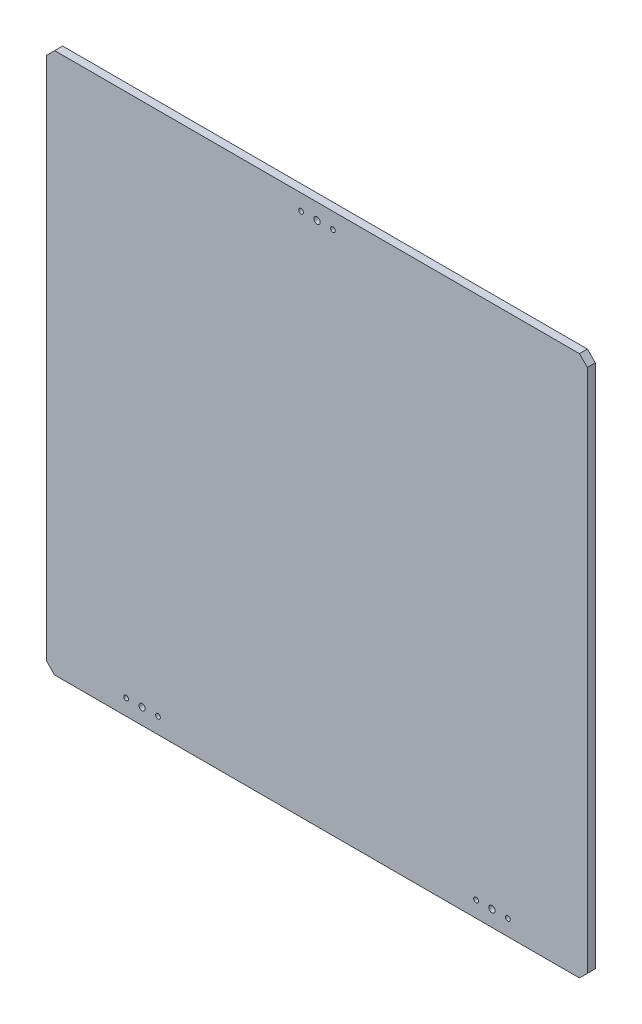
ISO-10303-21;
HEADER;
FILE_DESCRIPTION(('STEP AP214'),'2;1');
FILE_NAME('part.step','',(''),(''),'','','');
FILE_SCHEMA(('AUTOMOTIVE_DESIGN { 1 0 10303 214 1 1 1 1 }'));
ENDSEC;
DATA;
#1=APPLICATION_CONTEXT('core data for automotive mechanical design processes');
#2=APPLICATION_PROTOCOL_DEFINITION('international standard','automotive_design',2000,#1);
#3=PRODUCT_CONTEXT('',#1,'mechanical');
#4=PRODUCT('Part','Part','',(#3));
#5=PRODUCT_RELATED_PRODUCT_CATEGORY('part','',(#4));
#6=PRODUCT_DEFINITION_FORMATION('','',#4);
#7=PRODUCT_DEFINITION_CONTEXT('part definition',#1,'design');
#8=PRODUCT_DEFINITION('design','',#6,#7);
#9=PRODUCT_DEFINITION_SHAPE('','',#8);
#10=(LENGTH_UNIT() NAMED_UNIT(*) SI_UNIT(.MILLI.,.METRE.));
#11=(NAMED_UNIT(*) PLANE_ANGLE_UNIT() SI_UNIT($,.RADIAN.));
#12=(NAMED_UNIT(*) SI_UNIT($,.STERADIAN.) SOLID_ANGLE_UNIT());
#13=UNCERTAINTY_MEASURE_WITH_UNIT(LENGTH_MEASURE(1.E-05),#10,'distance_accuracy_value','');
#14=(GEOMETRIC_REPRESENTATION_CONTEXT(3) GLOBAL_UNCERTAINTY_ASSIGNED_CONTEXT((#13)) GLOBAL_UNIT_ASSIGNED_CONTEXT((#10,
#11,#12)) REPRESENTATION_CONTEXT('',''));
#15=CARTESIAN_POINT('',(0.,0.,0.));
#16=DIRECTION('',(0.,0.,1.));
#17=DIRECTION('',(1.,0.,0.));
#18=AXIS2_PLACEMENT_3D('',#15,#16,#17);
#19=CARTESIAN_POINT('',(170.,-170.,5.));
#20=DIRECTION('',(-1.,0.,0.));
#21=DIRECTION('',(0.,0.,1.));
#22=AXIS2_PLACEMENT_3D('',#19,#20,#21);
#23=PLANE('',#22);
#24=DIRECTION('',(0.,1.,0.));
#25=VECTOR('',#24,1.);
#26=CARTESIAN_POINT('',(170.,-170.,5.));
#27=LINE('',#26,#25);
#28=CARTESIAN_POINT('',(170.,-165.,5.));
#29=VERTEX_POINT('',#28);
#30=CARTESIAN_POINT('',(170.,165.,5.));
#31=VERTEX_POINT('',#30);
#32=EDGE_CURVE('E124',#29,#31,#27,.T.);
#33=ORIENTED_EDGE('',*,*,#32,.F.);
#34=DIRECTION('',(0.,0.,-1.));
#35=VECTOR('',#34,1.);
#36=CARTESIAN_POINT('',(170.,-165.,5.));
#37=LINE('',#36,#35);
#38=CARTESIAN_POINT('',(170.,-165.,0.));
#39=VERTEX_POINT('',#38);
#40=EDGE_CURVE('E150',#29,#39,#37,.T.);
#41=ORIENTED_EDGE('',*,*,#40,.T.);
#42=DIRECTION('',(0.,1.,0.));
#43=VECTOR('',#42,1.);
#44=CARTESIAN_POINT('',(170.,-170.,0.));
#45=LINE('',#44,#43);
#46=CARTESIAN_POINT('',(170.,165.,0.));
#47=VERTEX_POINT('',#46);
#48=EDGE_CURVE('E156',#39,#47,#45,.T.);
#49=ORIENTED_EDGE('',*,*,#48,.T.);
#50=DIRECTION('',(0.,0.,1.));
#51=VECTOR('',#50,1.);
#52=CARTESIAN_POINT('',(170.,165.,5.));
#53=LINE('',#52,#51);
#54=EDGE_CURVE('E148',#47,#31,#53,.T.);
#55=ORIENTED_EDGE('',*,*,#54,.T.);
#56=EDGE_LOOP('',(#33,#41,#49,#55));
#57=FACE_BOUND('',#56,.T.);
#58=ADVANCED_FACE('F32',(#57),#23,.F.);
#59=CARTESIAN_POINT('',(-170.,170.,5.));
#60=DIRECTION('',(0.,-1.,0.));
#61=DIRECTION('',(0.,0.,-1.));
#62=AXIS2_PLACEMENT_3D('',#59,#60,#61);
#63=PLANE('',#62);
#64=DIRECTION('',(-1.,0.,0.));
#65=VECTOR('',#64,1.);
#66=CARTESIAN_POINT('',(-170.,170.,5.));
#67=LINE('',#66,#65);
#68=CARTESIAN_POINT('',(165.,170.,5.));
#69=VERTEX_POINT('',#68);
#70=CARTESIAN_POINT('',(-165.,170.,5.));
#71=VERTEX_POINT('',#70);
#72=EDGE_CURVE('E127',#69,#71,#67,.T.);
#73=ORIENTED_EDGE('',*,*,#72,.F.);
#74=DIRECTION('',(0.,0.,-1.));
#75=VECTOR('',#74,1.);
#76=CARTESIAN_POINT('',(165.,170.,5.));
#77=LINE('',#76,#75);
#78=CARTESIAN_POINT('',(165.,170.,0.));
#79=VERTEX_POINT('',#78);
#80=EDGE_CURVE('E11',#69,#79,#77,.T.);
#81=ORIENTED_EDGE('',*,*,#80,.T.);
#82=DIRECTION('',(-1.,0.,0.));
#83=VECTOR('',#82,1.);
#84=CARTESIAN_POINT('',(-170.,170.,0.));
#85=LINE('',#84,#83);
#86=CARTESIAN_POINT('',(-165.,170.,0.));
#87=VERTEX_POINT('',#86);
#88=EDGE_CURVE('E129',#79,#87,#85,.T.);
#89=ORIENTED_EDGE('',*,*,#88,.T.);
#90=DIRECTION('',(0.,0.,1.));
#91=VECTOR('',#90,1.);
#92=CARTESIAN_POINT('',(-165.,170.,5.));
#93=LINE('',#92,#91);
#94=EDGE_CURVE('E40',#87,#71,#93,.T.);
#95=ORIENTED_EDGE('',*,*,#94,.T.);
#96=EDGE_LOOP('',(#73,#81,#89,#95));
#97=FACE_BOUND('',#96,.T.);
#98=ADVANCED_FACE('F262',(#97),#63,.F.);
#99=CARTESIAN_POINT('',(-170.,-170.,5.));
#100=DIRECTION('',(1.,0.,0.));
#101=DIRECTION('',(0.,0.,-1.));
#102=AXIS2_PLACEMENT_3D('',#99,#100,#101);
#103=PLANE('',#102);
#104=DIRECTION('',(0.,-1.,0.));
#105=VECTOR('',#104,1.);
#106=CARTESIAN_POINT('',(-170.,-170.,0.));
#107=LINE('',#106,#105);
#108=CARTESIAN_POINT('',(-170.,165.,0.));
#109=VERTEX_POINT('',#108);
#110=CARTESIAN_POINT('',(-170.,-165.,0.));
#111=VERTEX_POINT('',#110);
#112=EDGE_CURVE('E125',#109,#111,#107,.T.);
#113=ORIENTED_EDGE('',*,*,#112,.T.);
#114=DIRECTION('',(0.,0.,1.));
#115=VECTOR('',#114,1.);
#116=CARTESIAN_POINT('',(-170.,-165.,5.));
#117=LINE('',#116,#115);
#118=CARTESIAN_POINT('',(-170.,-165.,5.));
#119=VERTEX_POINT('',#118);
#120=EDGE_CURVE('E103',#111,#119,#117,.T.);
#121=ORIENTED_EDGE('',*,*,#120,.T.);
#122=DIRECTION('',(0.,-1.,0.));
#123=VECTOR('',#122,1.);
#124=CARTESIAN_POINT('',(-170.,-170.,5.));
#125=LINE('',#124,#123);
#126=CARTESIAN_POINT('',(-170.,165.,5.));
#127=VERTEX_POINT('',#126);
#128=EDGE_CURVE('E168',#127,#119,#125,.T.);
#129=ORIENTED_EDGE('',*,*,#128,.F.);
#130=DIRECTION('',(0.,0.,-1.));
#131=VECTOR('',#130,1.);
#132=CARTESIAN_POINT('',(-170.,165.,5.));
#133=LINE('',#132,#131);
#134=EDGE_CURVE('E108',#127,#109,#133,.T.);
#135=ORIENTED_EDGE('',*,*,#134,.T.);
#136=EDGE_LOOP('',(#113,#121,#129,#135));
#137=FACE_BOUND('',#136,.T.);
#138=ADVANCED_FACE('F260',(#137),#103,.F.);
#139=CARTESIAN_POINT('',(-170.,-170.,5.));
#140=DIRECTION('',(0.,1.,0.));
#141=DIRECTION('',(0.,0.,1.));
#142=AXIS2_PLACEMENT_3D('',#139,#140,#141);
#143=PLANE('',#142);
#144=DIRECTION('',(1.,0.,0.));
#145=VECTOR('',#144,1.);
#146=CARTESIAN_POINT('',(-170.,-170.,5.));
#147=LINE('',#146,#145);
#148=CARTESIAN_POINT('',(-165.,-170.,5.));
#149=VERTEX_POINT('',#148);
#150=CARTESIAN_POINT('',(165.,-170.,5.));
#151=VERTEX_POINT('',#150);
#152=EDGE_CURVE('E118',#149,#151,#147,.T.);
#153=ORIENTED_EDGE('',*,*,#152,.F.);
#154=DIRECTION('',(0.,0.,-1.));
#155=VECTOR('',#154,1.);
#156=CARTESIAN_POINT('',(-165.,-170.,5.));
#157=LINE('',#156,#155);
#158=CARTESIAN_POINT('',(-165.,-170.,0.));
#159=VERTEX_POINT('',#158);
#160=EDGE_CURVE('E102',#149,#159,#157,.T.);
#161=ORIENTED_EDGE('',*,*,#160,.T.);
#162=DIRECTION('',(1.,0.,0.));
#163=VECTOR('',#162,1.);
#164=CARTESIAN_POINT('',(-170.,-170.,0.));
#165=LINE('',#164,#163);
#166=CARTESIAN_POINT('',(165.,-170.,0.));
#167=VERTEX_POINT('',#166);
#168=EDGE_CURVE('E115',#159,#167,#165,.T.);
#169=ORIENTED_EDGE('',*,*,#168,.T.);
#170=DIRECTION('',(0.,0.,1.));
#171=VECTOR('',#170,1.);
#172=CARTESIAN_POINT('',(165.,-170.,5.));
#173=LINE('',#172,#171);
#174=EDGE_CURVE('E120',#167,#151,#173,.T.);
#175=ORIENTED_EDGE('',*,*,#174,.T.);
#176=EDGE_LOOP('',(#153,#161,#169,#175));
#177=FACE_BOUND('',#176,.T.);
#178=ADVANCED_FACE('F114',(#177),#143,.F.);
#179=CARTESIAN_POINT('',(0.,0.,5.));
#180=DIRECTION('',(0.,0.,-1.));
#181=DIRECTION('',(-1.,0.,0.));
#182=AXIS2_PLACEMENT_3D('',#179,#180,#181);
#183=PLANE('',#182);
#184=CARTESIAN_POINT('',(100.,-160.,5.));
#185=DIRECTION('',(0.,0.,-1.));
#186=DIRECTION('',(-1.,0.,0.));
#187=AXIS2_PLACEMENT_3D('',#184,#185,#186);
#188=CIRCLE('',#187,1.5);
#189=CARTESIAN_POINT('',(98.5,-160.,5.));
#190=VERTEX_POINT('',#189);
#191=EDGE_CURVE('E217',#190,#190,#188,.T.);
#192=ORIENTED_EDGE('',*,*,#191,.T.);
#193=EDGE_LOOP('',(#192));
#194=FACE_BOUND('',#193,.T.);
#195=CARTESIAN_POINT('',(110.,-160.,5.));
#196=DIRECTION('',(0.,0.,-1.));
#197=DIRECTION('',(-1.,0.,0.));
#198=AXIS2_PLACEMENT_3D('',#195,#196,#197);
#199=CIRCLE('',#198,2.);
#200=CARTESIAN_POINT('',(108.,-160.,5.));
#201=VERTEX_POINT('',#200);
#202=EDGE_CURVE('E211',#201,#201,#199,.T.);
#203=ORIENTED_EDGE('',*,*,#202,.T.);
#204=EDGE_LOOP('',(#203));
#205=FACE_BOUND('',#204,.T.);
#206=CARTESIAN_POINT('',(120.,-160.,5.));
#207=DIRECTION('',(0.,0.,-1.));
#208=DIRECTION('',(-1.,0.,0.));
#209=AXIS2_PLACEMENT_3D('',#206,#207,#208);
#210=CIRCLE('',#209,1.5);
#211=CARTESIAN_POINT('',(118.5,-160.,5.));
#212=VERTEX_POINT('',#211);
#213=EDGE_CURVE('E205',#212,#212,#210,.T.);
#214=ORIENTED_EDGE('',*,*,#213,.T.);
#215=EDGE_LOOP('',(#214));
#216=FACE_BOUND('',#215,.T.);
#217=CARTESIAN_POINT('',(10.,160.,5.));
#218=DIRECTION('',(0.,0.,1.));
#219=DIRECTION('',(1.,0.,0.));
#220=AXIS2_PLACEMENT_3D('',#217,#218,#219);
#221=CIRCLE('',#220,1.5);
#222=CARTESIAN_POINT('',(11.5,160.,5.));
#223=VERTEX_POINT('',#222);
#224=EDGE_CURVE('E199',#223,#223,#221,.T.);
#225=ORIENTED_EDGE('',*,*,#224,.F.);
#226=EDGE_LOOP('',(#225));
#227=FACE_BOUND('',#226,.T.);
#228=CARTESIAN_POINT('',(0.,160.,5.));
#229=DIRECTION('',(0.,0.,1.));
#230=DIRECTION('',(1.,0.,0.));
#231=AXIS2_PLACEMENT_3D('',#228,#229,#230);
#232=CIRCLE('',#231,2.);
#233=CARTESIAN_POINT('',(2.,160.,5.));
#234=VERTEX_POINT('',#233);
#235=EDGE_CURVE('E193',#234,#234,#232,.T.);
#236=ORIENTED_EDGE('',*,*,#235,.F.);
#237=EDGE_LOOP('',(#236));
#238=FACE_BOUND('',#237,.T.);
#239=CARTESIAN_POINT('',(-10.,160.,5.));
#240=DIRECTION('',(0.,0.,1.));
#241=DIRECTION('',(1.,0.,0.));
#242=AXIS2_PLACEMENT_3D('',#239,#240,#241);
#243=CIRCLE('',#242,1.5);
#244=CARTESIAN_POINT('',(-8.5,160.,5.));
#245=VERTEX_POINT('',#244);
#246=EDGE_CURVE('E187',#245,#245,#243,.T.);
#247=ORIENTED_EDGE('',*,*,#246,.F.);
#248=EDGE_LOOP('',(#247));
#249=FACE_BOUND('',#248,.T.);
#250=CARTESIAN_POINT('',(-100.,-160.,5.));
#251=DIRECTION('',(0.,0.,1.));
#252=DIRECTION('',(1.,0.,0.));
#253=AXIS2_PLACEMENT_3D('',#250,#251,#252);
#254=CIRCLE('',#253,1.5);
#255=CARTESIAN_POINT('',(-98.5,-160.,5.));
#256=VERTEX_POINT('',#255);
#257=EDGE_CURVE('E181',#256,#256,#254,.T.);
#258=ORIENTED_EDGE('',*,*,#257,.F.);
#259=EDGE_LOOP('',(#258));
#260=FACE_BOUND('',#259,.T.);
#261=CARTESIAN_POINT('',(-110.,-160.,5.));
#262=DIRECTION('',(0.,0.,1.));
#263=DIRECTION('',(1.,0.,0.));
#264=AXIS2_PLACEMENT_3D('',#261,#262,#263);
#265=CIRCLE('',#264,2.);
#266=CARTESIAN_POINT('',(-108.,-160.,5.));
#267=VERTEX_POINT('',#266);
#268=EDGE_CURVE('E175',#267,#267,#265,.T.);
#269=ORIENTED_EDGE('',*,*,#268,.F.);
#270=EDGE_LOOP('',(#269));
#271=FACE_BOUND('',#270,.T.);
#272=CARTESIAN_POINT('',(-120.,-160.,5.));
#273=DIRECTION('',(0.,0.,1.));
#274=DIRECTION('',(1.,0.,0.));
#275=AXIS2_PLACEMENT_3D('',#272,#273,#274);
#276=CIRCLE('',#275,1.5);
#277=CARTESIAN_POINT('',(-118.5,-160.,5.));
#278=VERTEX_POINT('',#277);
#279=EDGE_CURVE('E164',#278,#278,#276,.T.);
#280=ORIENTED_EDGE('',*,*,#279,.F.);
#281=EDGE_LOOP('',(#280));
#282=FACE_BOUND('',#281,.T.);
#283=ORIENTED_EDGE('',*,*,#128,.T.);
#284=DIRECTION('',(-0.707106781186544,0.707106781186551,0.));
#285=VECTOR('',#284,1.);
#286=CARTESIAN_POINT('',(-165.,-170.,5.));
#287=LINE('',#286,#285);
#288=EDGE_CURVE('E146',#119,#149,#287,.F.);
#289=ORIENTED_EDGE('',*,*,#288,.T.);
#290=ORIENTED_EDGE('',*,*,#152,.T.);
#291=DIRECTION('',(-0.707106781186551,-0.707106781186544,0.));
#292=VECTOR('',#291,1.);
#293=CARTESIAN_POINT('',(170.,-165.,5.));
#294=LINE('',#293,#292);
#295=EDGE_CURVE('E144',#151,#29,#294,.F.);
#296=ORIENTED_EDGE('',*,*,#295,.T.);
#297=ORIENTED_EDGE('',*,*,#32,.T.);
#298=DIRECTION('',(0.707106781186544,-0.707106781186551,0.));
#299=VECTOR('',#298,1.);
#300=CARTESIAN_POINT('',(165.,170.,5.));
#301=LINE('',#300,#299);
#302=EDGE_CURVE('E53',#31,#69,#301,.F.);
#303=ORIENTED_EDGE('',*,*,#302,.T.);
#304=ORIENTED_EDGE('',*,*,#72,.T.);
#305=DIRECTION('',(0.707106781186551,0.707106781186544,0.));
#306=VECTOR('',#305,1.);
#307=CARTESIAN_POINT('',(-170.,165.,5.));
#308=LINE('',#307,#306);
#309=EDGE_CURVE('E141',#71,#127,#308,.F.);
#310=ORIENTED_EDGE('',*,*,#309,.T.);
#311=EDGE_LOOP('',(#283,#289,#290,#296,#297,#303,#304,#310));
#312=FACE_BOUND('',#311,.T.);
#313=ADVANCED_FACE('F229',(#194,#205,#216,#227,#238,#249,#260,#271,#282,#312),#183,.F.);
#314=CARTESIAN_POINT('',(0.,0.,0.));
#315=DIRECTION('',(0.,0.,-1.));
#316=DIRECTION('',(-1.,0.,0.));
#317=AXIS2_PLACEMENT_3D('',#314,#315,#316);
#318=PLANE('',#317);
#319=CARTESIAN_POINT('',(100.,-160.,0.));
#320=DIRECTION('',(0.,0.,-1.));
#321=DIRECTION('',(-1.,0.,0.));
#322=AXIS2_PLACEMENT_3D('',#319,#320,#321);
#323=CIRCLE('',#322,1.5);
#324=CARTESIAN_POINT('',(98.5,-160.,0.));
#325=VERTEX_POINT('',#324);
#326=EDGE_CURVE('E214',#325,#325,#323,.T.);
#327=ORIENTED_EDGE('',*,*,#326,.F.);
#328=EDGE_LOOP('',(#327));
#329=FACE_BOUND('',#328,.T.);
#330=CARTESIAN_POINT('',(110.,-160.,0.));
#331=DIRECTION('',(0.,0.,-1.));
#332=DIRECTION('',(-1.,0.,0.));
#333=AXIS2_PLACEMENT_3D('',#330,#331,#332);
#334=CIRCLE('',#333,2.);
#335=CARTESIAN_POINT('',(108.,-160.,0.));
#336=VERTEX_POINT('',#335);
#337=EDGE_CURVE('E208',#336,#336,#334,.T.);
#338=ORIENTED_EDGE('',*,*,#337,.F.);
#339=EDGE_LOOP('',(#338));
#340=FACE_BOUND('',#339,.T.);
#341=CARTESIAN_POINT('',(120.,-160.,0.));
#342=DIRECTION('',(0.,0.,-1.));
#343=DIRECTION('',(-1.,0.,0.));
#344=AXIS2_PLACEMENT_3D('',#341,#342,#343);
#345=CIRCLE('',#344,1.5);
#346=CARTESIAN_POINT('',(118.5,-160.,0.));
#347=VERTEX_POINT('',#346);
#348=EDGE_CURVE('E202',#347,#347,#345,.T.);
#349=ORIENTED_EDGE('',*,*,#348,.F.);
#350=EDGE_LOOP('',(#349));
#351=FACE_BOUND('',#350,.T.);
#352=CARTESIAN_POINT('',(10.,160.,0.));
#353=DIRECTION('',(0.,0.,1.));
#354=DIRECTION('',(1.,0.,0.));
#355=AXIS2_PLACEMENT_3D('',#352,#353,#354);
#356=CIRCLE('',#355,1.5);
#357=CARTESIAN_POINT('',(11.5,160.,0.));
#358=VERTEX_POINT('',#357);
#359=EDGE_CURVE('E196',#358,#358,#356,.T.);
#360=ORIENTED_EDGE('',*,*,#359,.T.);
#361=EDGE_LOOP('',(#360));
#362=FACE_BOUND('',#361,.T.);
#363=CARTESIAN_POINT('',(0.,160.,0.));
#364=DIRECTION('',(0.,0.,1.));
#365=DIRECTION('',(1.,0.,0.));
#366=AXIS2_PLACEMENT_3D('',#363,#364,#365);
#367=CIRCLE('',#366,2.);
#368=CARTESIAN_POINT('',(2.,160.,0.));
#369=VERTEX_POINT('',#368);
#370=EDGE_CURVE('E190',#369,#369,#367,.T.);
#371=ORIENTED_EDGE('',*,*,#370,.T.);
#372=EDGE_LOOP('',(#371));
#373=FACE_BOUND('',#372,.T.);
#374=CARTESIAN_POINT('',(-10.,160.,0.));
#375=DIRECTION('',(0.,0.,1.));
#376=DIRECTION('',(1.,0.,0.));
#377=AXIS2_PLACEMENT_3D('',#374,#375,#376);
#378=CIRCLE('',#377,1.5);
#379=CARTESIAN_POINT('',(-8.5,160.,0.));
#380=VERTEX_POINT('',#379);
#381=EDGE_CURVE('E184',#380,#380,#378,.T.);
#382=ORIENTED_EDGE('',*,*,#381,.T.);
#383=EDGE_LOOP('',(#382));
#384=FACE_BOUND('',#383,.T.);
#385=CARTESIAN_POINT('',(-100.,-160.,0.));
#386=DIRECTION('',(0.,0.,1.));
#387=DIRECTION('',(1.,0.,0.));
#388=AXIS2_PLACEMENT_3D('',#385,#386,#387);
#389=CIRCLE('',#388,1.5);
#390=CARTESIAN_POINT('',(-98.5,-160.,0.));
#391=VERTEX_POINT('',#390);
#392=EDGE_CURVE('E178',#391,#391,#389,.T.);
#393=ORIENTED_EDGE('',*,*,#392,.T.);
#394=EDGE_LOOP('',(#393));
#395=FACE_BOUND('',#394,.T.);
#396=CARTESIAN_POINT('',(-110.,-160.,0.));
#397=DIRECTION('',(0.,0.,1.));
#398=DIRECTION('',(1.,0.,0.));
#399=AXIS2_PLACEMENT_3D('',#396,#397,#398);
#400=CIRCLE('',#399,2.);
#401=CARTESIAN_POINT('',(-108.,-160.,0.));
#402=VERTEX_POINT('',#401);
#403=EDGE_CURVE('E173',#402,#402,#400,.T.);
#404=ORIENTED_EDGE('',*,*,#403,.T.);
#405=EDGE_LOOP('',(#404));
#406=FACE_BOUND('',#405,.T.);
#407=CARTESIAN_POINT('',(-120.,-160.,0.));
#408=DIRECTION('',(0.,0.,1.));
#409=DIRECTION('',(1.,0.,0.));
#410=AXIS2_PLACEMENT_3D('',#407,#408,#409);
#411=CIRCLE('',#410,1.5);
#412=CARTESIAN_POINT('',(-118.5,-160.,0.));
#413=VERTEX_POINT('',#412);
#414=EDGE_CURVE('E161',#413,#413,#411,.T.);
#415=ORIENTED_EDGE('',*,*,#414,.T.);
#416=EDGE_LOOP('',(#415));
#417=FACE_BOUND('',#416,.T.);
#418=ORIENTED_EDGE('',*,*,#168,.F.);
#419=DIRECTION('',(0.707106781186544,-0.707106781186551,0.));
#420=VECTOR('',#419,1.);
#421=CARTESIAN_POINT('',(-167.500000000001,-167.499999999999,0.));
#422=LINE('',#421,#420);
#423=EDGE_CURVE('E98',#159,#111,#422,.F.);
#424=ORIENTED_EDGE('',*,*,#423,.T.);
#425=ORIENTED_EDGE('',*,*,#112,.F.);
#426=DIRECTION('',(-0.707106781186551,-0.707106781186544,0.));
#427=VECTOR('',#426,1.);
#428=CARTESIAN_POINT('',(-167.499999999999,167.500000000001,0.));
#429=LINE('',#428,#427);
#430=EDGE_CURVE('E119',#109,#87,#429,.F.);
#431=ORIENTED_EDGE('',*,*,#430,.T.);
#432=ORIENTED_EDGE('',*,*,#88,.F.);
#433=DIRECTION('',(-0.707106781186544,0.707106781186551,0.));
#434=VECTOR('',#433,1.);
#435=CARTESIAN_POINT('',(167.500000000001,167.499999999999,0.));
#436=LINE('',#435,#434);
#437=EDGE_CURVE('E135',#79,#47,#436,.F.);
#438=ORIENTED_EDGE('',*,*,#437,.T.);
#439=ORIENTED_EDGE('',*,*,#48,.F.);
#440=DIRECTION('',(0.707106781186551,0.707106781186544,0.));
#441=VECTOR('',#440,1.);
#442=CARTESIAN_POINT('',(167.499999999999,-167.500000000001,0.));
#443=LINE('',#442,#441);
#444=EDGE_CURVE('E109',#39,#167,#443,.F.);
#445=ORIENTED_EDGE('',*,*,#444,.T.);
#446=EDGE_LOOP('',(#418,#424,#425,#431,#432,#438,#439,#445));
#447=FACE_BOUND('',#446,.T.);
#448=ADVANCED_FACE('F122',(#329,#340,#351,#362,#373,#384,#395,#406,#417,#447),#318,.T.);
#449=CARTESIAN_POINT('',(-120.,-160.,0.));
#450=DIRECTION('',(0.,0.,1.));
#451=DIRECTION('',(1.,0.,0.));
#452=AXIS2_PLACEMENT_3D('',#449,#450,#451);
#453=CYLINDRICAL_SURFACE('',#452,1.5);
#454=ORIENTED_EDGE('',*,*,#414,.F.);
#455=EDGE_LOOP('',(#454));
#456=FACE_BOUND('',#455,.T.);
#457=ORIENTED_EDGE('',*,*,#279,.T.);
#458=EDGE_LOOP('',(#457));
#459=FACE_BOUND('',#458,.T.);
#460=ADVANCED_FACE('F228',(#456,#459),#453,.F.);
#461=CARTESIAN_POINT('',(-110.,-160.,0.));
#462=DIRECTION('',(0.,0.,1.));
#463=DIRECTION('',(1.,0.,0.));
#464=AXIS2_PLACEMENT_3D('',#461,#462,#463);
#465=CYLINDRICAL_SURFACE('',#464,2.);
#466=ORIENTED_EDGE('',*,*,#403,.F.);
#467=EDGE_LOOP('',(#466));
#468=FACE_BOUND('',#467,.T.);
#469=ORIENTED_EDGE('',*,*,#268,.T.);
#470=EDGE_LOOP('',(#469));
#471=FACE_BOUND('',#470,.T.);
#472=ADVANCED_FACE('F249',(#468,#471),#465,.F.);
#473=CARTESIAN_POINT('',(-100.,-160.,0.));
#474=DIRECTION('',(0.,0.,1.));
#475=DIRECTION('',(1.,0.,0.));
#476=AXIS2_PLACEMENT_3D('',#473,#474,#475);
#477=CYLINDRICAL_SURFACE('',#476,1.5);
#478=ORIENTED_EDGE('',*,*,#392,.F.);
#479=EDGE_LOOP('',(#478));
#480=FACE_BOUND('',#479,.T.);
#481=ORIENTED_EDGE('',*,*,#257,.T.);
#482=EDGE_LOOP('',(#481));
#483=FACE_BOUND('',#482,.T.);
#484=ADVANCED_FACE('F287',(#480,#483),#477,.F.);
#485=CARTESIAN_POINT('',(-10.,160.,0.));
#486=DIRECTION('',(0.,0.,1.));
#487=DIRECTION('',(1.,0.,0.));
#488=AXIS2_PLACEMENT_3D('',#485,#486,#487);
#489=CYLINDRICAL_SURFACE('',#488,1.5);
#490=ORIENTED_EDGE('',*,*,#381,.F.);
#491=EDGE_LOOP('',(#490));
#492=FACE_BOUND('',#491,.T.);
#493=ORIENTED_EDGE('',*,*,#246,.T.);
#494=EDGE_LOOP('',(#493));
#495=FACE_BOUND('',#494,.T.);
#496=ADVANCED_FACE('F291',(#492,#495),#489,.F.);
#497=CARTESIAN_POINT('',(0.,160.,0.));
#498=DIRECTION('',(0.,0.,1.));
#499=DIRECTION('',(1.,0.,0.));
#500=AXIS2_PLACEMENT_3D('',#497,#498,#499);
#501=CYLINDRICAL_SURFACE('',#500,2.);
#502=ORIENTED_EDGE('',*,*,#370,.F.);
#503=EDGE_LOOP('',(#502));
#504=FACE_BOUND('',#503,.T.);
#505=ORIENTED_EDGE('',*,*,#235,.T.);
#506=EDGE_LOOP('',(#505));
#507=FACE_BOUND('',#506,.T.);
#508=ADVANCED_FACE('F295',(#504,#507),#501,.F.);
#509=CARTESIAN_POINT('',(10.,160.,0.));
#510=DIRECTION('',(0.,0.,1.));
#511=DIRECTION('',(1.,0.,0.));
#512=AXIS2_PLACEMENT_3D('',#509,#510,#511);
#513=CYLINDRICAL_SURFACE('',#512,1.5);
#514=ORIENTED_EDGE('',*,*,#359,.F.);
#515=EDGE_LOOP('',(#514));
#516=FACE_BOUND('',#515,.T.);
#517=ORIENTED_EDGE('',*,*,#224,.T.);
#518=EDGE_LOOP('',(#517));
#519=FACE_BOUND('',#518,.T.);
#520=ADVANCED_FACE('F299',(#516,#519),#513,.F.);
#521=CARTESIAN_POINT('',(120.,-160.,0.));
#522=DIRECTION('',(0.,0.,1.));
#523=DIRECTION('',(1.,0.,0.));
#524=AXIS2_PLACEMENT_3D('',#521,#522,#523);
#525=CYLINDRICAL_SURFACE('',#524,1.5);
#526=ORIENTED_EDGE('',*,*,#348,.T.);
#527=EDGE_LOOP('',(#526));
#528=FACE_BOUND('',#527,.T.);
#529=ORIENTED_EDGE('',*,*,#213,.F.);
#530=EDGE_LOOP('',(#529));
#531=FACE_BOUND('',#530,.T.);
#532=ADVANCED_FACE('F303',(#528,#531),#525,.F.);
#533=CARTESIAN_POINT('',(110.,-160.,0.));
#534=DIRECTION('',(0.,0.,1.));
#535=DIRECTION('',(1.,0.,0.));
#536=AXIS2_PLACEMENT_3D('',#533,#534,#535);
#537=CYLINDRICAL_SURFACE('',#536,2.);
#538=ORIENTED_EDGE('',*,*,#337,.T.);
#539=EDGE_LOOP('',(#538));
#540=FACE_BOUND('',#539,.T.);
#541=ORIENTED_EDGE('',*,*,#202,.F.);
#542=EDGE_LOOP('',(#541));
#543=FACE_BOUND('',#542,.T.);
#544=ADVANCED_FACE('F307',(#540,#543),#537,.F.);
#545=CARTESIAN_POINT('',(100.,-160.,0.));
#546=DIRECTION('',(0.,0.,1.));
#547=DIRECTION('',(1.,0.,0.));
#548=AXIS2_PLACEMENT_3D('',#545,#546,#547);
#549=CYLINDRICAL_SURFACE('',#548,1.5);
#550=ORIENTED_EDGE('',*,*,#326,.T.);
#551=EDGE_LOOP('',(#550));
#552=FACE_BOUND('',#551,.T.);
#553=ORIENTED_EDGE('',*,*,#191,.F.);
#554=EDGE_LOOP('',(#553));
#555=FACE_BOUND('',#554,.T.);
#556=ADVANCED_FACE('F223',(#552,#555),#549,.F.);
#557=CARTESIAN_POINT('',(-165.,-170.,5.));
#558=DIRECTION('',(0.707106781186551,0.707106781186543,0.));
#559=DIRECTION('',(0.,0.,-1.));
#560=AXIS2_PLACEMENT_3D('',#557,#558,#559);
#561=PLANE('',#560);
#562=ORIENTED_EDGE('',*,*,#288,.F.);
#563=ORIENTED_EDGE('',*,*,#120,.F.);
#564=ORIENTED_EDGE('',*,*,#423,.F.);
#565=ORIENTED_EDGE('',*,*,#160,.F.);
#566=EDGE_LOOP('',(#562,#563,#564,#565));
#567=FACE_BOUND('',#566,.T.);
#568=ADVANCED_FACE('F101',(#567),#561,.F.);
#569=CARTESIAN_POINT('',(170.,-165.,5.));
#570=DIRECTION('',(-0.707106781186543,0.707106781186551,0.));
#571=DIRECTION('',(0.,0.,-1.));
#572=AXIS2_PLACEMENT_3D('',#569,#570,#571);
#573=PLANE('',#572);
#574=ORIENTED_EDGE('',*,*,#295,.F.);
#575=ORIENTED_EDGE('',*,*,#174,.F.);
#576=ORIENTED_EDGE('',*,*,#444,.F.);
#577=ORIENTED_EDGE('',*,*,#40,.F.);
#578=EDGE_LOOP('',(#574,#575,#576,#577));
#579=FACE_BOUND('',#578,.T.);
#580=ADVANCED_FACE('F266',(#579),#573,.F.);
#581=CARTESIAN_POINT('',(165.,170.,5.));
#582=DIRECTION('',(-0.707106781186551,-0.707106781186544,0.));
#583=DIRECTION('',(0.,0.,-1.));
#584=AXIS2_PLACEMENT_3D('',#581,#582,#583);
#585=PLANE('',#584);
#586=ORIENTED_EDGE('',*,*,#302,.F.);
#587=ORIENTED_EDGE('',*,*,#54,.F.);
#588=ORIENTED_EDGE('',*,*,#437,.F.);
#589=ORIENTED_EDGE('',*,*,#80,.F.);
#590=EDGE_LOOP('',(#586,#587,#588,#589));
#591=FACE_BOUND('',#590,.T.);
#592=ADVANCED_FACE('F265',(#591),#585,.F.);
#593=CARTESIAN_POINT('',(-170.,165.,5.));
#594=DIRECTION('',(0.707106781186544,-0.707106781186551,0.));
#595=DIRECTION('',(0.,0.,-1.));
#596=AXIS2_PLACEMENT_3D('',#593,#594,#595);
#597=PLANE('',#596);
#598=ORIENTED_EDGE('',*,*,#309,.F.);
#599=ORIENTED_EDGE('',*,*,#94,.F.);
#600=ORIENTED_EDGE('',*,*,#430,.F.);
#601=ORIENTED_EDGE('',*,*,#134,.F.);
#602=EDGE_LOOP('',(#598,#599,#600,#601));
#603=FACE_BOUND('',#602,.T.);
#604=ADVANCED_FACE('F34',(#603),#597,.F.);
#605=CLOSED_SHELL('',(#58,#98,#138,#178,#313,#448,#460,#472,#484,#496,#508,#520,#532,#544,#556,
#568,#580,#592,#604));
#606=MANIFOLD_SOLID_BREP('B2',#605);
#607=ADVANCED_BREP_SHAPE_REPRESENTATION('',(#18,#606),#14);
#608=SHAPE_DEFINITION_REPRESENTATION(#9,#607);
ENDSEC;
END-ISO-10303-21;
